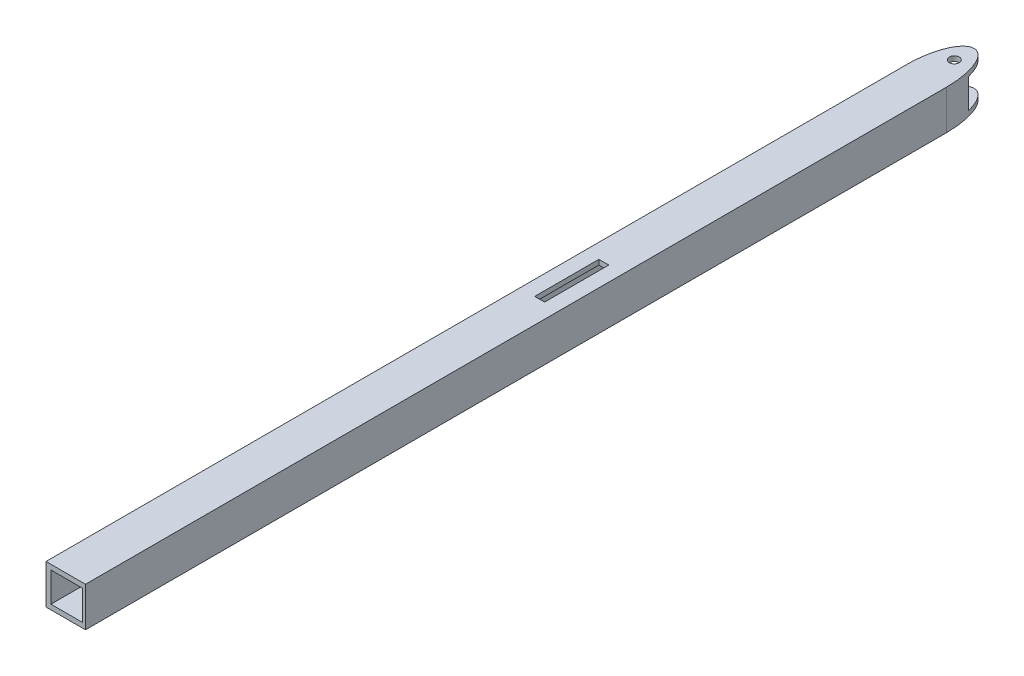
ISO-10303-21;
HEADER;
FILE_DESCRIPTION(('STEP AP214'),'2;1');
FILE_NAME('part.step','',(''),(''),'','','');
FILE_SCHEMA(('AUTOMOTIVE_DESIGN { 1 0 10303 214 1 1 1 1 }'));
ENDSEC;
DATA;
#1=APPLICATION_CONTEXT('core data for automotive mechanical design processes');
#2=APPLICATION_PROTOCOL_DEFINITION('international standard','automotive_design',2000,#1);
#3=PRODUCT_CONTEXT('',#1,'mechanical');
#4=PRODUCT('Part','Part','',(#3));
#5=PRODUCT_RELATED_PRODUCT_CATEGORY('part','',(#4));
#6=PRODUCT_DEFINITION_FORMATION('','',#4);
#7=PRODUCT_DEFINITION_CONTEXT('part definition',#1,'design');
#8=PRODUCT_DEFINITION('design','',#6,#7);
#9=PRODUCT_DEFINITION_SHAPE('','',#8);
#10=(LENGTH_UNIT() NAMED_UNIT(*) SI_UNIT(.MILLI.,.METRE.));
#11=(NAMED_UNIT(*) PLANE_ANGLE_UNIT() SI_UNIT($,.RADIAN.));
#12=(NAMED_UNIT(*) SI_UNIT($,.STERADIAN.) SOLID_ANGLE_UNIT());
#13=UNCERTAINTY_MEASURE_WITH_UNIT(LENGTH_MEASURE(1.E-05),#10,'distance_accuracy_value','');
#14=(GEOMETRIC_REPRESENTATION_CONTEXT(3) GLOBAL_UNCERTAINTY_ASSIGNED_CONTEXT((#13)) GLOBAL_UNIT_ASSIGNED_CONTEXT((#10,
#11,#12)) REPRESENTATION_CONTEXT('',''));
#15=CARTESIAN_POINT('',(0.,0.,0.));
#16=DIRECTION('',(0.,0.,1.));
#17=DIRECTION('',(1.,0.,0.));
#18=AXIS2_PLACEMENT_3D('',#15,#16,#17);
#19=CARTESIAN_POINT('',(0.,0.,584.2));
#20=DIRECTION('',(0.,1.,0.));
#21=DIRECTION('',(0.,0.,1.));
#22=AXIS2_PLACEMENT_3D('',#19,#20,#21);
#23=PLANE('',#22);
#24=CARTESIAN_POINT('',(12.7,0.,30.4658600757156));
#25=DIRECTION('',(0.,1.,0.));
#26=DIRECTION('',(0.,0.,-1.));
#27=AXIS2_PLACEMENT_3D('',#24,#25,#26);
#28=ELLIPSE('',#27,30.4658600757156,12.7);
#29=CARTESIAN_POINT('',(25.4,0.,30.4658600757156));
#30=VERTEX_POINT('',#29);
#31=CARTESIAN_POINT('',(0.,0.,30.4658600757156));
#32=VERTEX_POINT('',#31);
#33=EDGE_CURVE('E242',#30,#32,#28,.T.);
#34=ORIENTED_EDGE('',*,*,#33,.F.);
#35=DIRECTION('',(0.,0.,-1.));
#36=VECTOR('',#35,1.);
#37=CARTESIAN_POINT('',(25.4,0.,584.2));
#38=LINE('',#37,#36);
#39=CARTESIAN_POINT('',(25.4,0.,584.2));
#40=VERTEX_POINT('',#39);
#41=EDGE_CURVE('E370',#40,#30,#38,.T.);
#42=ORIENTED_EDGE('',*,*,#41,.F.);
#43=DIRECTION('',(1.,0.,0.));
#44=VECTOR('',#43,1.);
#45=CARTESIAN_POINT('',(0.,0.,584.2));
#46=LINE('',#45,#44);
#47=CARTESIAN_POINT('',(0.,0.,584.2));
#48=VERTEX_POINT('',#47);
#49=EDGE_CURVE('E361',#48,#40,#46,.T.);
#50=ORIENTED_EDGE('',*,*,#49,.F.);
#51=DIRECTION('',(0.,0.,-1.));
#52=VECTOR('',#51,1.);
#53=CARTESIAN_POINT('',(0.,0.,584.2));
#54=LINE('',#53,#52);
#55=EDGE_CURVE('E374',#48,#32,#54,.T.);
#56=ORIENTED_EDGE('',*,*,#55,.T.);
#57=EDGE_LOOP('',(#34,#42,#50,#56));
#58=FACE_BOUND('',#57,.T.);
#59=CARTESIAN_POINT('',(12.7,0.,12.7));
#60=DIRECTION('',(0.,1.,0.));
#61=DIRECTION('',(0.,0.,1.));
#62=AXIS2_PLACEMENT_3D('',#59,#60,#61);
#63=CIRCLE('',#62,3.175);
#64=CARTESIAN_POINT('',(12.7,0.,15.875));
#65=VERTEX_POINT('',#64);
#66=EDGE_CURVE('E225',#65,#65,#63,.T.);
#67=ORIENTED_EDGE('',*,*,#66,.T.);
#68=EDGE_LOOP('',(#67));
#69=FACE_BOUND('',#68,.T.);
#70=DIRECTION('',(1.,0.,0.));
#71=VECTOR('',#70,1.);
#72=CARTESIAN_POINT('',(0.,0.,238.121175757414));
#73=LINE('',#72,#71);
#74=CARTESIAN_POINT('',(9.52499999999986,0.,238.121175757414));
#75=VERTEX_POINT('',#74);
#76=CARTESIAN_POINT('',(15.8749999999999,0.,238.121175757414));
#77=VERTEX_POINT('',#76);
#78=EDGE_CURVE('E163',#75,#77,#73,.T.);
#79=ORIENTED_EDGE('',*,*,#78,.F.);
#80=DIRECTION('',(0.,0.,-1.));
#81=VECTOR('',#80,1.);
#82=CARTESIAN_POINT('',(9.52499999999986,0.,0.));
#83=LINE('',#82,#81);
#84=CARTESIAN_POINT('',(9.52499999999986,0.,279.4));
#85=VERTEX_POINT('',#84);
#86=EDGE_CURVE('E155',#85,#75,#83,.T.);
#87=ORIENTED_EDGE('',*,*,#86,.F.);
#88=DIRECTION('',(1.,0.,0.));
#89=VECTOR('',#88,1.);
#90=CARTESIAN_POINT('',(0.,0.,279.4));
#91=LINE('',#90,#89);
#92=CARTESIAN_POINT('',(15.8749999999999,0.,279.4));
#93=VERTEX_POINT('',#92);
#94=EDGE_CURVE('E56',#85,#93,#91,.T.);
#95=ORIENTED_EDGE('',*,*,#94,.T.);
#96=DIRECTION('',(0.,0.,-1.));
#97=VECTOR('',#96,1.);
#98=CARTESIAN_POINT('',(15.8749999999999,0.,0.));
#99=LINE('',#98,#97);
#100=EDGE_CURVE('E177',#93,#77,#99,.T.);
#101=ORIENTED_EDGE('',*,*,#100,.T.);
#102=EDGE_LOOP('',(#79,#87,#95,#101));
#103=FACE_BOUND('',#102,.T.);
#104=ADVANCED_FACE('F40',(#58,#69,#103),#23,.F.);
#105=CARTESIAN_POINT('',(0.,25.4,584.2));
#106=DIRECTION('',(0.,1.,0.));
#107=DIRECTION('',(0.,0.,1.));
#108=AXIS2_PLACEMENT_3D('',#105,#106,#107);
#109=PLANE('',#108);
#110=CARTESIAN_POINT('',(12.7,25.4,12.7));
#111=DIRECTION('',(0.,1.,0.));
#112=DIRECTION('',(0.,0.,1.));
#113=AXIS2_PLACEMENT_3D('',#110,#111,#112);
#114=CIRCLE('',#113,3.175);
#115=CARTESIAN_POINT('',(12.7,25.4,15.875));
#116=VERTEX_POINT('',#115);
#117=EDGE_CURVE('E224',#116,#116,#114,.T.);
#118=ORIENTED_EDGE('',*,*,#117,.F.);
#119=EDGE_LOOP('',(#118));
#120=FACE_BOUND('',#119,.T.);
#121=DIRECTION('',(0.,0.,-1.));
#122=VECTOR('',#121,1.);
#123=CARTESIAN_POINT('',(25.4,25.4,584.2));
#124=LINE('',#123,#122);
#125=CARTESIAN_POINT('',(25.4,25.4,584.2));
#126=VERTEX_POINT('',#125);
#127=CARTESIAN_POINT('',(25.4,25.4,30.4658600757156));
#128=VERTEX_POINT('',#127);
#129=EDGE_CURVE('E295',#126,#128,#124,.T.);
#130=ORIENTED_EDGE('',*,*,#129,.T.);
#131=CARTESIAN_POINT('',(12.7,25.4,30.4658600757156));
#132=DIRECTION('',(0.,1.,0.));
#133=DIRECTION('',(0.,0.,-1.));
#134=AXIS2_PLACEMENT_3D('',#131,#132,#133);
#135=ELLIPSE('',#134,30.4658600757156,12.7);
#136=CARTESIAN_POINT('',(0.,25.4,30.4658600757156));
#137=VERTEX_POINT('',#136);
#138=EDGE_CURVE('E241',#128,#137,#135,.T.);
#139=ORIENTED_EDGE('',*,*,#138,.T.);
#140=DIRECTION('',(0.,0.,-1.));
#141=VECTOR('',#140,1.);
#142=CARTESIAN_POINT('',(0.,25.4,584.2));
#143=LINE('',#142,#141);
#144=CARTESIAN_POINT('',(0.,25.4,584.2));
#145=VERTEX_POINT('',#144);
#146=EDGE_CURVE('E364',#145,#137,#143,.T.);
#147=ORIENTED_EDGE('',*,*,#146,.F.);
#148=DIRECTION('',(1.,0.,0.));
#149=VECTOR('',#148,1.);
#150=CARTESIAN_POINT('',(0.,25.4,584.2));
#151=LINE('',#150,#149);
#152=EDGE_CURVE('E355',#145,#126,#151,.T.);
#153=ORIENTED_EDGE('',*,*,#152,.T.);
#154=EDGE_LOOP('',(#130,#139,#147,#153));
#155=FACE_BOUND('',#154,.T.);
#156=DIRECTION('',(0.,0.,-1.));
#157=VECTOR('',#156,1.);
#158=CARTESIAN_POINT('',(9.52499999999986,25.4,0.));
#159=LINE('',#158,#157);
#160=CARTESIAN_POINT('',(9.52499999999986,25.4,279.4));
#161=VERTEX_POINT('',#160);
#162=CARTESIAN_POINT('',(9.52499999999986,25.4,238.121175757413));
#163=VERTEX_POINT('',#162);
#164=EDGE_CURVE('E192',#161,#163,#159,.T.);
#165=ORIENTED_EDGE('',*,*,#164,.T.);
#166=DIRECTION('',(1.,0.,0.));
#167=VECTOR('',#166,1.);
#168=CARTESIAN_POINT('',(0.,25.4,238.121175757414));
#169=LINE('',#168,#167);
#170=CARTESIAN_POINT('',(15.8749999999999,25.4,238.121175757414));
#171=VERTEX_POINT('',#170);
#172=EDGE_CURVE('E64',#163,#171,#169,.T.);
#173=ORIENTED_EDGE('',*,*,#172,.T.);
#174=DIRECTION('',(0.,0.,-1.));
#175=VECTOR('',#174,1.);
#176=CARTESIAN_POINT('',(15.8749999999999,25.4,0.));
#177=LINE('',#176,#175);
#178=CARTESIAN_POINT('',(15.8749999999999,25.4,279.4));
#179=VERTEX_POINT('',#178);
#180=EDGE_CURVE('E179',#179,#171,#177,.T.);
#181=ORIENTED_EDGE('',*,*,#180,.F.);
#182=DIRECTION('',(1.,0.,0.));
#183=VECTOR('',#182,1.);
#184=CARTESIAN_POINT('',(0.,25.4,279.4));
#185=LINE('',#184,#183);
#186=EDGE_CURVE('E183',#161,#179,#185,.T.);
#187=ORIENTED_EDGE('',*,*,#186,.F.);
#188=EDGE_LOOP('',(#165,#173,#181,#187));
#189=FACE_BOUND('',#188,.T.);
#190=ADVANCED_FACE('F262',(#120,#155,#189),#109,.T.);
#191=CARTESIAN_POINT('',(23.4777661909682,22.225,584.2));
#192=DIRECTION('',(0.,1.,0.));
#193=DIRECTION('',(0.,0.,1.));
#194=AXIS2_PLACEMENT_3D('',#191,#192,#193);
#195=PLANE('',#194);
#196=CARTESIAN_POINT('',(12.7,22.225,30.4658600757156));
#197=DIRECTION('',(0.,1.,0.));
#198=DIRECTION('',(0.,0.,-1.));
#199=AXIS2_PLACEMENT_3D('',#196,#197,#198);
#200=ELLIPSE('',#199,30.4658600757156,12.7);
#201=CARTESIAN_POINT('',(23.4777661909682,22.225,14.350455438504));
#202=VERTEX_POINT('',#201);
#203=CARTESIAN_POINT('',(3.175,22.225,10.3145877662069));
#204=VERTEX_POINT('',#203);
#205=EDGE_CURVE('E316',#202,#204,#200,.T.);
#206=ORIENTED_EDGE('',*,*,#205,.F.);
#207=DIRECTION('',(0.,0.,-1.));
#208=VECTOR('',#207,1.);
#209=CARTESIAN_POINT('',(23.4777661909682,22.225,584.2));
#210=LINE('',#209,#208);
#211=CARTESIAN_POINT('',(23.4777661909682,22.225,584.2));
#212=VERTEX_POINT('',#211);
#213=EDGE_CURVE('E347',#212,#202,#210,.T.);
#214=ORIENTED_EDGE('',*,*,#213,.F.);
#215=DIRECTION('',(1.,0.,0.));
#216=VECTOR('',#215,1.);
#217=CARTESIAN_POINT('',(23.4777661909682,22.225,584.2));
#218=LINE('',#217,#216);
#219=CARTESIAN_POINT('',(3.175,22.225,584.2));
#220=VERTEX_POINT('',#219);
#221=EDGE_CURVE('E331',#220,#212,#218,.T.);
#222=ORIENTED_EDGE('',*,*,#221,.F.);
#223=DIRECTION('',(0.,0.,-1.));
#224=VECTOR('',#223,1.);
#225=CARTESIAN_POINT('',(3.175,22.225,584.2));
#226=LINE('',#225,#224);
#227=EDGE_CURVE('E343',#220,#204,#226,.T.);
#228=ORIENTED_EDGE('',*,*,#227,.T.);
#229=EDGE_LOOP('',(#206,#214,#222,#228));
#230=FACE_BOUND('',#229,.T.);
#231=CARTESIAN_POINT('',(12.7,22.225,12.7));
#232=DIRECTION('',(0.,1.,0.));
#233=DIRECTION('',(0.,0.,1.));
#234=AXIS2_PLACEMENT_3D('',#231,#232,#233);
#235=CIRCLE('',#234,3.175);
#236=CARTESIAN_POINT('',(12.7,22.225,15.875));
#237=VERTEX_POINT('',#236);
#238=EDGE_CURVE('E233',#237,#237,#235,.T.);
#239=ORIENTED_EDGE('',*,*,#238,.T.);
#240=EDGE_LOOP('',(#239));
#241=FACE_BOUND('',#240,.T.);
#242=DIRECTION('',(1.,0.,0.));
#243=VECTOR('',#242,1.);
#244=CARTESIAN_POINT('',(23.4777661909682,22.225,238.121175757414));
#245=LINE('',#244,#243);
#246=CARTESIAN_POINT('',(9.52499999999986,22.225,238.121175757414));
#247=VERTEX_POINT('',#246);
#248=CARTESIAN_POINT('',(15.8749999999999,22.225,238.121175757414));
#249=VERTEX_POINT('',#248);
#250=EDGE_CURVE('E221',#247,#249,#245,.T.);
#251=ORIENTED_EDGE('',*,*,#250,.F.);
#252=DIRECTION('',(0.,0.,-1.));
#253=VECTOR('',#252,1.);
#254=CARTESIAN_POINT('',(9.52499999999986,22.225,584.2));
#255=LINE('',#254,#253);
#256=CARTESIAN_POINT('',(9.52499999999986,22.225,279.4));
#257=VERTEX_POINT('',#256);
#258=EDGE_CURVE('E202',#257,#247,#255,.T.);
#259=ORIENTED_EDGE('',*,*,#258,.F.);
#260=DIRECTION('',(1.,0.,0.));
#261=VECTOR('',#260,1.);
#262=CARTESIAN_POINT('',(23.4777661909682,22.225,279.4));
#263=LINE('',#262,#261);
#264=CARTESIAN_POINT('',(15.8749999999999,22.225,279.4));
#265=VERTEX_POINT('',#264);
#266=EDGE_CURVE('E213',#257,#265,#263,.T.);
#267=ORIENTED_EDGE('',*,*,#266,.T.);
#268=DIRECTION('',(0.,0.,-1.));
#269=VECTOR('',#268,1.);
#270=CARTESIAN_POINT('',(15.8749999999999,22.225,584.2));
#271=LINE('',#270,#269);
#272=EDGE_CURVE('E217',#265,#249,#271,.T.);
#273=ORIENTED_EDGE('',*,*,#272,.T.);
#274=EDGE_LOOP('',(#251,#259,#267,#273));
#275=FACE_BOUND('',#274,.T.);
#276=ADVANCED_FACE('F258',(#230,#241,#275),#195,.F.);
#277=CARTESIAN_POINT('',(23.4777661909682,3.175,584.2));
#278=DIRECTION('',(0.,-1.,0.));
#279=DIRECTION('',(0.,0.,-1.));
#280=AXIS2_PLACEMENT_3D('',#277,#278,#279);
#281=PLANE('',#280);
#282=DIRECTION('',(0.,0.,-1.));
#283=VECTOR('',#282,1.);
#284=CARTESIAN_POINT('',(23.4777661909682,3.175,584.2));
#285=LINE('',#284,#283);
#286=CARTESIAN_POINT('',(23.4777661909682,3.175,584.2));
#287=VERTEX_POINT('',#286);
#288=CARTESIAN_POINT('',(23.4777661909682,3.175,14.350455438504));
#289=VERTEX_POINT('',#288);
#290=EDGE_CURVE('E335',#287,#289,#285,.T.);
#291=ORIENTED_EDGE('',*,*,#290,.T.);
#292=CARTESIAN_POINT('',(12.7,3.175,30.4658600757156));
#293=DIRECTION('',(0.,1.,0.));
#294=DIRECTION('',(0.,0.,-1.));
#295=AXIS2_PLACEMENT_3D('',#292,#293,#294);
#296=ELLIPSE('',#295,30.4658600757156,12.7);
#297=CARTESIAN_POINT('',(3.175,3.175,10.3145877662069));
#298=VERTEX_POINT('',#297);
#299=EDGE_CURVE('E378',#298,#289,#296,.F.);
#300=ORIENTED_EDGE('',*,*,#299,.F.);
#301=DIRECTION('',(0.,0.,-1.));
#302=VECTOR('',#301,1.);
#303=CARTESIAN_POINT('',(3.175,3.175,584.2));
#304=LINE('',#303,#302);
#305=CARTESIAN_POINT('',(3.175,3.175,584.2));
#306=VERTEX_POINT('',#305);
#307=EDGE_CURVE('E339',#306,#298,#304,.T.);
#308=ORIENTED_EDGE('',*,*,#307,.F.);
#309=DIRECTION('',(-1.,0.,0.));
#310=VECTOR('',#309,1.);
#311=CARTESIAN_POINT('',(23.4777661909682,3.175,584.2));
#312=LINE('',#311,#310);
#313=EDGE_CURVE('E323',#287,#306,#312,.T.);
#314=ORIENTED_EDGE('',*,*,#313,.F.);
#315=EDGE_LOOP('',(#291,#300,#308,#314));
#316=FACE_BOUND('',#315,.T.);
#317=CARTESIAN_POINT('',(12.7,3.175,12.7));
#318=DIRECTION('',(0.,-1.,0.));
#319=DIRECTION('',(0.,0.,-1.));
#320=AXIS2_PLACEMENT_3D('',#317,#318,#319);
#321=CIRCLE('',#320,3.175);
#322=CARTESIAN_POINT('',(12.7,3.175,9.525));
#323=VERTEX_POINT('',#322);
#324=EDGE_CURVE('E229',#323,#323,#321,.T.);
#325=ORIENTED_EDGE('',*,*,#324,.T.);
#326=EDGE_LOOP('',(#325));
#327=FACE_BOUND('',#326,.T.);
#328=DIRECTION('',(-1.,0.,0.));
#329=VECTOR('',#328,1.);
#330=CARTESIAN_POINT('',(23.4777661909682,3.175,238.121175757414));
#331=LINE('',#330,#329);
#332=CARTESIAN_POINT('',(15.8749999999999,3.175,238.121175757414));
#333=VERTEX_POINT('',#332);
#334=CARTESIAN_POINT('',(9.52499999999986,3.175,238.121175757413));
#335=VERTEX_POINT('',#334);
#336=EDGE_CURVE('E12',#333,#335,#331,.T.);
#337=ORIENTED_EDGE('',*,*,#336,.F.);
#338=DIRECTION('',(0.,0.,1.));
#339=VECTOR('',#338,1.);
#340=CARTESIAN_POINT('',(15.8749999999999,3.175,584.2));
#341=LINE('',#340,#339);
#342=CARTESIAN_POINT('',(15.8749999999999,3.175,279.4));
#343=VERTEX_POINT('',#342);
#344=EDGE_CURVE('E49',#333,#343,#341,.T.);
#345=ORIENTED_EDGE('',*,*,#344,.T.);
#346=DIRECTION('',(-1.,0.,0.));
#347=VECTOR('',#346,1.);
#348=CARTESIAN_POINT('',(23.4777661909682,3.175,279.4));
#349=LINE('',#348,#347);
#350=CARTESIAN_POINT('',(9.52499999999986,3.175,279.4));
#351=VERTEX_POINT('',#350);
#352=EDGE_CURVE('E388',#343,#351,#349,.T.);
#353=ORIENTED_EDGE('',*,*,#352,.T.);
#354=DIRECTION('',(0.,0.,1.));
#355=VECTOR('',#354,1.);
#356=CARTESIAN_POINT('',(9.52499999999986,3.175,584.2));
#357=LINE('',#356,#355);
#358=EDGE_CURVE('E385',#335,#351,#357,.T.);
#359=ORIENTED_EDGE('',*,*,#358,.F.);
#360=EDGE_LOOP('',(#337,#345,#353,#359));
#361=FACE_BOUND('',#360,.T.);
#362=ADVANCED_FACE('F261',(#316,#327,#361),#281,.F.);
#363=CARTESIAN_POINT('',(23.4777661909682,22.225,584.2));
#364=DIRECTION('',(1.,0.,0.));
#365=DIRECTION('',(0.,1.,0.));
#366=AXIS2_PLACEMENT_3D('',#363,#364,#365);
#367=PLANE('',#366);
#368=DIRECTION('',(0.,1.,0.));
#369=VECTOR('',#368,1.);
#370=CARTESIAN_POINT('',(23.4777661909682,0.,14.350455438504));
#371=LINE('',#370,#369);
#372=EDGE_CURVE('E381',#289,#202,#371,.T.);
#373=ORIENTED_EDGE('',*,*,#372,.F.);
#374=ORIENTED_EDGE('',*,*,#290,.F.);
#375=DIRECTION('',(0.,-1.,0.));
#376=VECTOR('',#375,1.);
#377=CARTESIAN_POINT('',(23.4777661909682,22.225,584.2));
#378=LINE('',#377,#376);
#379=EDGE_CURVE('E319',#212,#287,#378,.T.);
#380=ORIENTED_EDGE('',*,*,#379,.F.);
#381=ORIENTED_EDGE('',*,*,#213,.T.);
#382=EDGE_LOOP('',(#373,#374,#380,#381));
#383=FACE_BOUND('',#382,.T.);
#384=ADVANCED_FACE('F267',(#383),#367,.F.);
#385=CARTESIAN_POINT('',(3.175,22.225,584.2));
#386=DIRECTION('',(-1.,0.,0.));
#387=DIRECTION('',(0.,-1.,0.));
#388=AXIS2_PLACEMENT_3D('',#385,#386,#387);
#389=PLANE('',#388);
#390=DIRECTION('',(0.,1.,0.));
#391=VECTOR('',#390,1.);
#392=CARTESIAN_POINT('',(3.175,0.,10.3145877662069));
#393=LINE('',#392,#391);
#394=EDGE_CURVE('E314',#204,#298,#393,.F.);
#395=ORIENTED_EDGE('',*,*,#394,.F.);
#396=ORIENTED_EDGE('',*,*,#227,.F.);
#397=DIRECTION('',(0.,1.,0.));
#398=VECTOR('',#397,1.);
#399=CARTESIAN_POINT('',(3.175,22.225,584.2));
#400=LINE('',#399,#398);
#401=EDGE_CURVE('E327',#306,#220,#400,.T.);
#402=ORIENTED_EDGE('',*,*,#401,.F.);
#403=ORIENTED_EDGE('',*,*,#307,.T.);
#404=EDGE_LOOP('',(#395,#396,#402,#403));
#405=FACE_BOUND('',#404,.T.);
#406=ADVANCED_FACE('F264',(#405),#389,.F.);
#407=CARTESIAN_POINT('',(0.,0.,584.2));
#408=DIRECTION('',(-1.,0.,0.));
#409=DIRECTION('',(0.,-1.,0.));
#410=AXIS2_PLACEMENT_3D('',#407,#408,#409);
#411=PLANE('',#410);
#412=DIRECTION('',(0.,1.,0.));
#413=VECTOR('',#412,1.);
#414=CARTESIAN_POINT('',(0.,0.,30.4658600757156));
#415=LINE('',#414,#413);
#416=EDGE_CURVE('E246',#32,#137,#415,.T.);
#417=ORIENTED_EDGE('',*,*,#416,.F.);
#418=ORIENTED_EDGE('',*,*,#55,.F.);
#419=DIRECTION('',(0.,1.,0.));
#420=VECTOR('',#419,1.);
#421=CARTESIAN_POINT('',(0.,0.,584.2));
#422=LINE('',#421,#420);
#423=EDGE_CURVE('E351',#48,#145,#422,.T.);
#424=ORIENTED_EDGE('',*,*,#423,.T.);
#425=ORIENTED_EDGE('',*,*,#146,.T.);
#426=EDGE_LOOP('',(#417,#418,#424,#425));
#427=FACE_BOUND('',#426,.T.);
#428=ADVANCED_FACE('F42',(#427),#411,.T.);
#429=CARTESIAN_POINT('',(25.4,0.,584.2));
#430=DIRECTION('',(-1.,0.,0.));
#431=DIRECTION('',(0.,-1.,0.));
#432=AXIS2_PLACEMENT_3D('',#429,#430,#431);
#433=PLANE('',#432);
#434=ORIENTED_EDGE('',*,*,#41,.T.);
#435=DIRECTION('',(0.,1.,0.));
#436=VECTOR('',#435,1.);
#437=CARTESIAN_POINT('',(25.4,0.,30.4658600757156));
#438=LINE('',#437,#436);
#439=EDGE_CURVE('E237',#30,#128,#438,.T.);
#440=ORIENTED_EDGE('',*,*,#439,.T.);
#441=ORIENTED_EDGE('',*,*,#129,.F.);
#442=DIRECTION('',(0.,1.,0.));
#443=VECTOR('',#442,1.);
#444=CARTESIAN_POINT('',(25.4,0.,584.2));
#445=LINE('',#444,#443);
#446=EDGE_CURVE('E358',#40,#126,#445,.T.);
#447=ORIENTED_EDGE('',*,*,#446,.F.);
#448=EDGE_LOOP('',(#434,#440,#441,#447));
#449=FACE_BOUND('',#448,.T.);
#450=ADVANCED_FACE('F277',(#449),#433,.F.);
#451=CARTESIAN_POINT('',(0.,0.,584.2));
#452=DIRECTION('',(0.,0.,-1.));
#453=DIRECTION('',(-1.,0.,0.));
#454=AXIS2_PLACEMENT_3D('',#451,#452,#453);
#455=PLANE('',#454);
#456=ORIENTED_EDGE('',*,*,#221,.T.);
#457=ORIENTED_EDGE('',*,*,#379,.T.);
#458=ORIENTED_EDGE('',*,*,#313,.T.);
#459=ORIENTED_EDGE('',*,*,#401,.T.);
#460=EDGE_LOOP('',(#456,#457,#458,#459));
#461=FACE_BOUND('',#460,.T.);
#462=ORIENTED_EDGE('',*,*,#423,.F.);
#463=ORIENTED_EDGE('',*,*,#49,.T.);
#464=ORIENTED_EDGE('',*,*,#446,.T.);
#465=ORIENTED_EDGE('',*,*,#152,.F.);
#466=EDGE_LOOP('',(#462,#463,#464,#465));
#467=FACE_BOUND('',#466,.T.);
#468=ADVANCED_FACE('F254',(#461,#467),#455,.F.);
#469=DIRECTION('',(0.,1.,0.));
#470=VECTOR('',#469,1.);
#471=SURFACE_OF_LINEAR_EXTRUSION('',#28,#470);
#472=ORIENTED_EDGE('',*,*,#299,.T.);
#473=ORIENTED_EDGE('',*,*,#372,.T.);
#474=ORIENTED_EDGE('',*,*,#205,.T.);
#475=ORIENTED_EDGE('',*,*,#394,.T.);
#476=EDGE_LOOP('',(#472,#473,#474,#475));
#477=FACE_BOUND('',#476,.T.);
#478=ORIENTED_EDGE('',*,*,#439,.F.);
#479=ORIENTED_EDGE('',*,*,#33,.T.);
#480=ORIENTED_EDGE('',*,*,#416,.T.);
#481=ORIENTED_EDGE('',*,*,#138,.F.);
#482=EDGE_LOOP('',(#478,#479,#480,#481));
#483=FACE_BOUND('',#482,.T.);
#484=ADVANCED_FACE('F249',(#477,#483),#471,.T.);
#485=CARTESIAN_POINT('',(12.7,0.,12.7));
#486=DIRECTION('',(0.,1.,0.));
#487=DIRECTION('',(0.,0.,1.));
#488=AXIS2_PLACEMENT_3D('',#485,#486,#487);
#489=CYLINDRICAL_SURFACE('',#488,3.175);
#490=ORIENTED_EDGE('',*,*,#66,.F.);
#491=EDGE_LOOP('',(#490));
#492=FACE_BOUND('',#491,.T.);
#493=ORIENTED_EDGE('',*,*,#324,.F.);
#494=EDGE_LOOP('',(#493));
#495=FACE_BOUND('',#494,.T.);
#496=ADVANCED_FACE('F253',(#492,#495),#489,.F.);
#497=ORIENTED_EDGE('',*,*,#117,.T.);
#498=EDGE_LOOP('',(#497));
#499=FACE_BOUND('',#498,.T.);
#500=ORIENTED_EDGE('',*,*,#238,.F.);
#501=EDGE_LOOP('',(#500));
#502=FACE_BOUND('',#501,.T.);
#503=ADVANCED_FACE('F256',(#499,#502),#489,.F.);
#504=CARTESIAN_POINT('',(9.52499999999986,0.,0.));
#505=DIRECTION('',(1.,0.,0.));
#506=DIRECTION('',(0.,0.,-1.));
#507=AXIS2_PLACEMENT_3D('',#504,#505,#506);
#508=PLANE('',#507);
#509=ORIENTED_EDGE('',*,*,#358,.T.);
#510=DIRECTION('',(0.,1.,0.));
#511=VECTOR('',#510,1.);
#512=CARTESIAN_POINT('',(9.52499999999986,0.,279.4));
#513=LINE('',#512,#511);
#514=EDGE_CURVE('E159',#85,#351,#513,.T.);
#515=ORIENTED_EDGE('',*,*,#514,.F.);
#516=ORIENTED_EDGE('',*,*,#86,.T.);
#517=DIRECTION('',(0.,1.,0.));
#518=VECTOR('',#517,1.);
#519=CARTESIAN_POINT('',(9.52499999999986,0.,238.121175757414));
#520=LINE('',#519,#518);
#521=EDGE_CURVE('E158',#75,#335,#520,.T.);
#522=ORIENTED_EDGE('',*,*,#521,.T.);
#523=EDGE_LOOP('',(#509,#515,#516,#522));
#524=FACE_BOUND('',#523,.T.);
#525=ADVANCED_FACE('F157',(#524),#508,.T.);
#526=CARTESIAN_POINT('',(0.,0.,279.4));
#527=DIRECTION('',(0.,0.,1.));
#528=DIRECTION('',(1.,0.,0.));
#529=AXIS2_PLACEMENT_3D('',#526,#527,#528);
#530=PLANE('',#529);
#531=DIRECTION('',(0.,1.,0.));
#532=VECTOR('',#531,1.);
#533=CARTESIAN_POINT('',(15.8749999999999,0.,279.4));
#534=LINE('',#533,#532);
#535=EDGE_CURVE('E204',#93,#343,#534,.T.);
#536=ORIENTED_EDGE('',*,*,#535,.F.);
#537=ORIENTED_EDGE('',*,*,#94,.F.);
#538=ORIENTED_EDGE('',*,*,#514,.T.);
#539=ORIENTED_EDGE('',*,*,#352,.F.);
#540=EDGE_LOOP('',(#536,#537,#538,#539));
#541=FACE_BOUND('',#540,.T.);
#542=ADVANCED_FACE('F397',(#541),#530,.F.);
#543=CARTESIAN_POINT('',(15.8749999999999,0.,0.));
#544=DIRECTION('',(1.,0.,0.));
#545=DIRECTION('',(0.,0.,-1.));
#546=AXIS2_PLACEMENT_3D('',#543,#544,#545);
#547=PLANE('',#546);
#548=DIRECTION('',(0.,1.,0.));
#549=VECTOR('',#548,1.);
#550=CARTESIAN_POINT('',(15.8749999999999,0.,238.121175757414));
#551=LINE('',#550,#549);
#552=EDGE_CURVE('E199',#77,#333,#551,.T.);
#553=ORIENTED_EDGE('',*,*,#552,.F.);
#554=ORIENTED_EDGE('',*,*,#100,.F.);
#555=ORIENTED_EDGE('',*,*,#535,.T.);
#556=ORIENTED_EDGE('',*,*,#344,.F.);
#557=EDGE_LOOP('',(#553,#554,#555,#556));
#558=FACE_BOUND('',#557,.T.);
#559=ADVANCED_FACE('F396',(#558),#547,.F.);
#560=CARTESIAN_POINT('',(0.,0.,238.121175757414));
#561=DIRECTION('',(0.,0.,1.));
#562=DIRECTION('',(1.,0.,0.));
#563=AXIS2_PLACEMENT_3D('',#560,#561,#562);
#564=PLANE('',#563);
#565=ORIENTED_EDGE('',*,*,#336,.T.);
#566=ORIENTED_EDGE('',*,*,#521,.F.);
#567=ORIENTED_EDGE('',*,*,#78,.T.);
#568=ORIENTED_EDGE('',*,*,#552,.T.);
#569=EDGE_LOOP('',(#565,#566,#567,#568));
#570=FACE_BOUND('',#569,.T.);
#571=ADVANCED_FACE('F166',(#570),#564,.T.);
#572=ORIENTED_EDGE('',*,*,#250,.T.);
#573=EDGE_CURVE('E203',#249,#171,#551,.T.);
#574=ORIENTED_EDGE('',*,*,#573,.T.);
#575=ORIENTED_EDGE('',*,*,#172,.F.);
#576=EDGE_CURVE('E173',#247,#163,#520,.T.);
#577=ORIENTED_EDGE('',*,*,#576,.F.);
#578=EDGE_LOOP('',(#572,#574,#575,#577));
#579=FACE_BOUND('',#578,.T.);
#580=ADVANCED_FACE('F414',(#579),#564,.T.);
#581=EDGE_CURVE('E208',#265,#179,#534,.T.);
#582=ORIENTED_EDGE('',*,*,#581,.T.);
#583=ORIENTED_EDGE('',*,*,#180,.T.);
#584=ORIENTED_EDGE('',*,*,#573,.F.);
#585=ORIENTED_EDGE('',*,*,#272,.F.);
#586=EDGE_LOOP('',(#582,#583,#584,#585));
#587=FACE_BOUND('',#586,.T.);
#588=ADVANCED_FACE('F406',(#587),#547,.F.);
#589=EDGE_CURVE('E172',#257,#161,#513,.T.);
#590=ORIENTED_EDGE('',*,*,#589,.T.);
#591=ORIENTED_EDGE('',*,*,#186,.T.);
#592=ORIENTED_EDGE('',*,*,#581,.F.);
#593=ORIENTED_EDGE('',*,*,#266,.F.);
#594=EDGE_LOOP('',(#590,#591,#592,#593));
#595=FACE_BOUND('',#594,.T.);
#596=ADVANCED_FACE('F400',(#595),#530,.F.);
#597=ORIENTED_EDGE('',*,*,#258,.T.);
#598=ORIENTED_EDGE('',*,*,#576,.T.);
#599=ORIENTED_EDGE('',*,*,#164,.F.);
#600=ORIENTED_EDGE('',*,*,#589,.F.);
#601=EDGE_LOOP('',(#597,#598,#599,#600));
#602=FACE_BOUND('',#601,.T.);
#603=ADVANCED_FACE('F300',(#602),#508,.T.);
#604=CLOSED_SHELL('',(#104,#190,#276,#362,#384,#406,#428,#450,#468,#484,#496,#503,#525,#542,
#559,#571,#580,#588,#596,#603));
#605=MANIFOLD_SOLID_BREP('B2',#604);
#606=ADVANCED_BREP_SHAPE_REPRESENTATION('',(#18,#605),#14);
#607=SHAPE_DEFINITION_REPRESENTATION(#9,#606);
ENDSEC;
END-ISO-10303-21;
